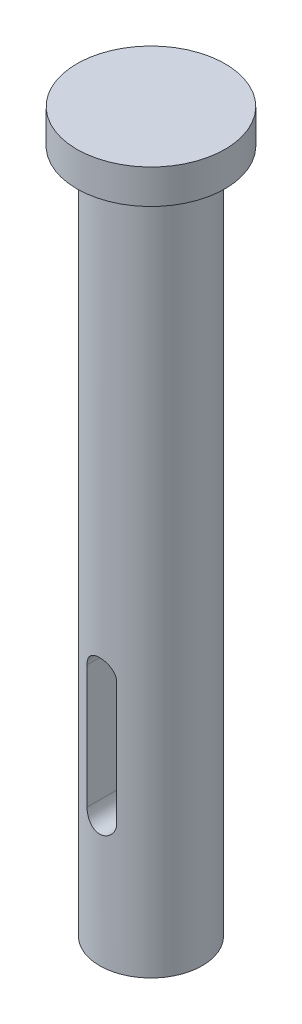
ISO-10303-21;
HEADER;
FILE_DESCRIPTION(('STEP AP214'),'2;1');
FILE_NAME('part.step','',(''),(''),'','','');
FILE_SCHEMA(('AUTOMOTIVE_DESIGN { 1 0 10303 214 1 1 1 1 }'));
ENDSEC;
DATA;
#1=APPLICATION_CONTEXT('core data for automotive mechanical design processes');
#2=APPLICATION_PROTOCOL_DEFINITION('international standard','automotive_design',2000,#1);
#3=PRODUCT_CONTEXT('',#1,'mechanical');
#4=PRODUCT('Part','Part','',(#3));
#5=PRODUCT_RELATED_PRODUCT_CATEGORY('part','',(#4));
#6=PRODUCT_DEFINITION_FORMATION('','',#4);
#7=PRODUCT_DEFINITION_CONTEXT('part definition',#1,'design');
#8=PRODUCT_DEFINITION('design','',#6,#7);
#9=PRODUCT_DEFINITION_SHAPE('','',#8);
#10=(LENGTH_UNIT() NAMED_UNIT(*) SI_UNIT(.MILLI.,.METRE.));
#11=(NAMED_UNIT(*) PLANE_ANGLE_UNIT() SI_UNIT($,.RADIAN.));
#12=(NAMED_UNIT(*) SI_UNIT($,.STERADIAN.) SOLID_ANGLE_UNIT());
#13=UNCERTAINTY_MEASURE_WITH_UNIT(LENGTH_MEASURE(1.E-05),#10,'distance_accuracy_value','');
#14=(GEOMETRIC_REPRESENTATION_CONTEXT(3) GLOBAL_UNCERTAINTY_ASSIGNED_CONTEXT((#13)) GLOBAL_UNIT_ASSIGNED_CONTEXT((#10,
#11,#12)) REPRESENTATION_CONTEXT('',''));
#15=CARTESIAN_POINT('',(0.,0.,0.));
#16=DIRECTION('',(0.,0.,1.));
#17=DIRECTION('',(1.,0.,0.));
#18=AXIS2_PLACEMENT_3D('',#15,#16,#17);
#19=CARTESIAN_POINT('',(0.,160.02,0.));
#20=DIRECTION('',(0.,-1.,0.));
#21=DIRECTION('',(0.,0.,-1.));
#22=AXIS2_PLACEMENT_3D('',#19,#20,#21);
#23=CYLINDRICAL_SURFACE('',#22,11.43);
#24=CARTESIAN_POINT('',(0.,0.,0.));
#25=DIRECTION('',(0.,1.,0.));
#26=DIRECTION('',(0.,0.,1.));
#27=AXIS2_PLACEMENT_3D('',#24,#25,#26);
#28=CIRCLE('',#27,11.43);
#29=CARTESIAN_POINT('',(0.,0.,11.43));
#30=VERTEX_POINT('',#29);
#31=EDGE_CURVE('E153',#30,#30,#28,.T.);
#32=ORIENTED_EDGE('',*,*,#31,.T.);
#33=EDGE_LOOP('',(#32));
#34=FACE_BOUND('',#33,.T.);
#35=DIRECTION('',(0.,-1.,0.));
#36=VECTOR('',#35,1.);
#37=CARTESIAN_POINT('',(3.30199968300475,160.02,10.9426549837522));
#38=LINE('',#37,#36);
#39=CARTESIAN_POINT('',(3.30199968300475,56.1339996695718,10.9426549837522));
#40=VERTEX_POINT('',#39);
#41=CARTESIAN_POINT('',(3.30199968300478,28.702000652588,10.9426549837522));
#42=VERTEX_POINT('',#41);
#43=EDGE_CURVE('E82',#40,#42,#38,.T.);
#44=ORIENTED_EDGE('',*,*,#43,.T.);
#45=CARTESIAN_POINT('',(3.30199968300478,28.702000652588,10.9426549837522));
#46=CARTESIAN_POINT('',(3.30201083959326,28.6112112309869,10.9426429087671));
#47=CARTESIAN_POINT('',(3.2982555000493,28.5204288218974,10.9437845945731));
#48=CARTESIAN_POINT('',(3.28329845120707,28.3395534855812,10.9482858329146));
#49=CARTESIAN_POINT('',(3.27209831420528,28.2494604168329,10.9516449171478));
#50=CARTESIAN_POINT('',(3.24237390580761,28.0708147684955,10.9604807615123));
#51=CARTESIAN_POINT('',(3.22386726106636,27.9822590130391,10.9659524244373));
#52=CARTESIAN_POINT('',(3.17970921283354,27.8071152644384,10.978837580216));
#53=CARTESIAN_POINT('',(3.15405764400974,27.7205273168791,10.9862511180043));
#54=CARTESIAN_POINT('',(3.06669238552717,27.4646642030274,11.0110858179221));
#55=CARTESIAN_POINT('',(2.99453188264708,27.2990741012283,11.0311125369567));
#56=CARTESIAN_POINT('',(2.82460736121545,26.9823585032287,11.0758370133616));
#57=CARTESIAN_POINT('',(2.72683262011485,26.8312391009682,11.1005367257192));
#58=CARTESIAN_POINT('',(2.5053851800656,26.5432786270554,11.1526316818163));
#59=CARTESIAN_POINT('',(2.38109716111845,26.4069195688495,11.1800808566986));
#60=CARTESIAN_POINT('',(2.11147003232109,26.1566620276346,11.2341208915755));
#61=CARTESIAN_POINT('',(1.96612742462546,26.0427672841112,11.2607116080533));
#62=CARTESIAN_POINT('',(1.65509365009165,25.8385901350348,11.3106500088386));
#63=CARTESIAN_POINT('',(1.48906766416633,25.7487987342244,11.333926285317));
#64=CARTESIAN_POINT('',(1.14349509824243,25.5985994154898,11.3739845243319));
#65=CARTESIAN_POINT('',(0.963951818965169,25.5381843510042,11.3907680661922));
#66=CARTESIAN_POINT('',(0.601510727887433,25.4500408390082,11.4155677099243));
#67=CARTESIAN_POINT('',(0.418829686833354,25.4214845278902,11.4238054567622));
#68=CARTESIAN_POINT('',(0.0510924066887405,25.3952559026843,11.4313640511465));
#69=CARTESIAN_POINT('',(-0.133963413049841,25.3975782088518,11.4306864519455));
#70=CARTESIAN_POINT('',(-0.495397591399471,25.4324769811574,11.4206490058453));
#71=CARTESIAN_POINT('',(-0.671870754801768,25.4641571001583,11.4115463996912));
#72=CARTESIAN_POINT('',(-1.01687808512803,25.5554129724509,11.3859913480712));
#73=CARTESIAN_POINT('',(-1.18541184716721,25.6149901467144,11.3695385282148));
#74=CARTESIAN_POINT('',(-1.51194497621491,25.7609845032003,11.3307669774951));
#75=CARTESIAN_POINT('',(-1.66980652361981,25.8476924884333,11.3083851148713));
#76=CARTESIAN_POINT('',(-1.9690292557211,26.0452554529799,11.2601432863006));
#77=CARTESIAN_POINT('',(-2.1103870044902,26.1561154467827,11.2342825985002));
#78=CARTESIAN_POINT('',(-2.37793178215076,26.4035212222926,11.1807708066999));
#79=CARTESIAN_POINT('',(-2.50339565956968,26.540843679194,11.1530887472081));
#80=CARTESIAN_POINT('',(-2.72972929794975,26.8348532248857,11.0998661849813));
#81=CARTESIAN_POINT('',(-2.83059204499695,26.9915458170633,11.0743262943487));
#82=CARTESIAN_POINT('',(-3.00558608673521,27.3218475127088,11.0281311836041));
#83=CARTESIAN_POINT('',(-3.07947321999842,27.4955939001078,11.0075211348333));
#84=CARTESIAN_POINT('',(-3.16735344932953,27.7639319406655,10.9824254132337));
#85=CARTESIAN_POINT('',(-3.19281956446441,27.8546493909043,10.9750307749866));
#86=CARTESIAN_POINT('',(-3.23593023283908,28.0380597002293,10.9623978810592));
#87=CARTESIAN_POINT('',(-3.25357840619661,28.1307516241467,10.9571586274028));
#88=CARTESIAN_POINT('',(-3.27880211126455,28.3031792093433,10.9496350189902));
#89=CARTESIAN_POINT('',(-3.28750207364252,28.3827389975838,10.947022239621));
#90=CARTESIAN_POINT('',(-3.29909958616893,28.542196377068,10.943530029869));
#91=CARTESIAN_POINT('',(-3.30200592117769,28.6220932725115,10.9426479752252));
#92=CARTESIAN_POINT('',(-3.30200031699521,28.7020000185976,10.9426547924424));
#93=B_SPLINE_CURVE_WITH_KNOTS('',3,(#45,#46,#47,#48,#49,#50,#51,#52,#53,#54,#55,#56,#57,#58,#59,
#60,#61,#62,#63,#64,#65,#66,#67,#68,#69,#70,#71,#72,#73,#74,#75,#76,#77,#78,#79,#80,#81,#82,#83,
#84,#85,#86,#87,#88,#89,#90,#91,#92),.UNSPECIFIED.,.F.,.F.,(4,2,2,2,2,2,2,2,2,2,2,2,2,2,2,2,2,2,
2,2,2,2,2,4),(0.,0.27227147527736,0.544485466717382,0.81604672682224,1.08761427132711,
1.63010064254451,2.17281447153649,2.72984963807595,3.28697745245675,3.85471570174013,
4.42231576467131,4.9747955768686,5.52717913600924,6.06323414713446,6.59931646587124,
7.14135390825003,7.68350399698142,8.24503882955919,8.80673357207435,9.37339317231377,
9.65663330028747,9.93974213575611,10.1797502575283,10.4193941780254),.UNSPECIFIED.);
#94=CARTESIAN_POINT('',(-3.30200031699524,28.7020000185976,10.9426547924424));
#95=VERTEX_POINT('',#94);
#96=EDGE_CURVE('E113',#42,#95,#93,.T.);
#97=ORIENTED_EDGE('',*,*,#96,.T.);
#98=DIRECTION('',(0.,-1.,0.));
#99=VECTOR('',#98,1.);
#100=CARTESIAN_POINT('',(-3.30200031699527,160.02,10.9426547924424));
#101=LINE('',#100,#99);
#102=CARTESIAN_POINT('',(-3.30200031699527,56.1340003035623,10.9426547924424));
#103=VERTEX_POINT('',#102);
#104=EDGE_CURVE('E112',#95,#103,#101,.F.);
#105=ORIENTED_EDGE('',*,*,#104,.T.);
#106=CARTESIAN_POINT('',(-3.30200031699525,56.1340003035623,10.9426547924424));
#107=CARTESIAN_POINT('',(-3.30201144729442,56.224789726793,10.9426427253901));
#108=CARTESIAN_POINT('',(-3.29825608132859,56.3155721363102,10.9437844194061));
#109=CARTESIAN_POINT('',(-3.28329897963043,56.4964474710653,10.9482856744644));
#110=CARTESIAN_POINT('',(-3.2720988161964,56.5865405378255,10.9516447672037));
#111=CARTESIAN_POINT('',(-3.24237435523471,56.7651861797615,10.9604806285998));
#112=CARTESIAN_POINT('',(-3.22386768436513,56.8537419308112,10.9659523000488));
#113=CARTESIAN_POINT('',(-3.17970958434121,57.0288856683113,10.9788374726768));
#114=CARTESIAN_POINT('',(-3.15405798985411,57.1154736091767,10.9862510187902));
#115=CARTESIAN_POINT('',(-3.06669265546892,57.3713366994661,11.0110857430294));
#116=CARTESIAN_POINT('',(-2.9945321033401,57.5369267811046,11.0311124774379));
#117=CARTESIAN_POINT('',(-2.82460748731822,57.8536423311356,11.0758369815945));
#118=CARTESIAN_POINT('',(-2.72683270086808,58.0047617055793,11.1005367063304));
#119=CARTESIAN_POINT('',(-2.5053851717744,58.2927221187623,11.152631684168));
#120=CARTESIAN_POINT('',(-2.38109710884742,58.4290811435535,11.1800808683481));
#121=CARTESIAN_POINT('',(-2.11146989717645,58.6793386107683,11.2341209174904));
#122=CARTESIAN_POINT('',(-1.96612725059404,58.7932333137115,11.2607116389351));
#123=CARTESIAN_POINT('',(-1.65509340784502,58.9974103715154,11.3106500447416));
#124=CARTESIAN_POINT('',(-1.48906739317617,59.0872017221889,11.3339263212909));
#125=CARTESIAN_POINT('',(-1.14349477827938,59.237400936101,11.3739845568681));
#126=CARTESIAN_POINT('',(-0.963951478772977,59.2978159459069,11.3907680952222));
#127=CARTESIAN_POINT('',(-0.601510362396344,59.3859593456628,11.4155677293346));
#128=CARTESIAN_POINT('',(-0.41882931624041,59.414515600151,11.4238054703489));
#129=CARTESIAN_POINT('',(-0.0510920356885373,59.4407441126334,11.4313640528076));
#130=CARTESIAN_POINT('',(0.133963779357455,59.4384217503681,11.4306864475035));
#131=CARTESIAN_POINT('',(0.495397941649429,59.4035228696293,11.4206489905516));
#132=CARTESIAN_POINT('',(0.671871093918139,59.371842697826,11.411546379498));
#133=CARTESIAN_POINT('',(1.01687839375541,59.2805867228353,11.3859913202822));
#134=CARTESIAN_POINT('',(1.18541213643744,59.2210094986717,11.3695384977286));
#135=CARTESIAN_POINT('',(1.511945223487,59.0750150439461,11.3307669442273));
#136=CARTESIAN_POINT('',(1.66980674784278,58.9883070097286,11.3083850814044));
#137=CARTESIAN_POINT('',(1.96902942636009,58.7907439509166,11.2601432561019));
#138=CARTESIAN_POINT('',(2.11038714459439,58.679883911836,11.2342825717698));
#139=CARTESIAN_POINT('',(2.37793185216547,58.4324780496227,11.1807707913564));
#140=CARTESIAN_POINT('',(2.50339568990815,58.2951555516051,11.1530887399377));
#141=CARTESIAN_POINT('',(2.72972924226733,58.0011459300188,11.0998661982118));
#142=CARTESIAN_POINT('',(2.83059194296475,57.8444533030621,11.0743263200085));
#143=CARTESIAN_POINT('',(3.00558588236283,57.5141515513603,11.0281312388506));
#144=CARTESIAN_POINT('',(3.07947296057822,57.3404051433141,11.0075212070864));
#145=CARTESIAN_POINT('',(3.16735310544411,57.0720670796585,10.9824255123268));
#146=CARTESIAN_POINT('',(3.1928191921037,56.9813496230956,10.9750308832496));
#147=CARTESIAN_POINT('',(3.23592980314594,56.7979393038028,10.9623980078375));
#148=CARTESIAN_POINT('',(3.25357794765006,56.7052473762414,10.9571587635257));
#149=CARTESIAN_POINT('',(3.27880158270072,56.5328199005894,10.9496351772149));
#150=CARTESIAN_POINT('',(3.28750151217978,56.4532602264254,10.9470224082113));
#151=CARTESIAN_POINT('',(3.29909897575358,56.2938030776155,10.9435302138826));
#152=CARTESIAN_POINT('',(3.30200529468888,56.2139062987662,10.942648164303));
#153=CARTESIAN_POINT('',(3.30199968300475,56.1339996695718,10.9426549837522));
#154=B_SPLINE_CURVE_WITH_KNOTS('',3,(#106,#107,#108,#109,#110,#111,#112,#113,#114,#115,#116,
#117,#118,#119,#120,#121,#122,#123,#124,#125,#126,#127,#128,#129,#130,#131,#132,#133,#134,#135,
#136,#137,#138,#139,#140,#141,#142,#143,#144,#145,#146,#147,#148,#149,#150,#151,#152,#153),
.UNSPECIFIED.,.F.,.F.,(4,2,2,2,2,2,2,2,2,2,2,2,2,2,2,2,2,2,2,2,2,2,2,4),(0.,0.272271480130543,
0.544485476356451,0.816046741088104,1.08761429023994,1.63010067014953,2.17281450804257,
2.72984969314374,3.2869775259252,3.85471577933668,4.42231584629948,4.9747956467213,
5.52717919415642,6.06323420127886,6.59931651610072,7.1413539685628,7.6835040673262,
8.24503890682228,8.80673365633093,9.37339324345031,9.65663336449064,9.93974219290006,
10.1797499639468,10.4193935340125),.UNSPECIFIED.);
#155=EDGE_CURVE('E56',#103,#40,#154,.T.);
#156=ORIENTED_EDGE('',*,*,#155,.T.);
#157=EDGE_LOOP('',(#44,#97,#105,#156));
#158=FACE_BOUND('',#157,.T.);
#159=DIRECTION('',(0.,-1.,0.));
#160=VECTOR('',#159,1.);
#161=CARTESIAN_POINT('',(3.30199968300475,160.02,-10.9426549837522));
#162=LINE('',#161,#160);
#163=CARTESIAN_POINT('',(3.30199968300478,28.702000652588,-10.9426549837522));
#164=VERTEX_POINT('',#163);
#165=CARTESIAN_POINT('',(3.30199968300475,56.1339996695718,-10.9426549837522));
#166=VERTEX_POINT('',#165);
#167=EDGE_CURVE('E90',#164,#166,#162,.F.);
#168=ORIENTED_EDGE('',*,*,#167,.T.);
#169=CARTESIAN_POINT('',(3.30199968300475,56.1339996695718,-10.9426549837522));
#170=CARTESIAN_POINT('',(3.30201083073519,56.2247890920399,-10.9426429114403));
#171=CARTESIAN_POINT('',(3.29825548226283,56.3155715015917,-10.9437845999403));
#172=CARTESIAN_POINT('',(3.28329841550615,56.4964468380206,-10.9482858436276));
#173=CARTESIAN_POINT('',(3.27209826951882,56.5865399064195,-10.9516449305123));
#174=CARTESIAN_POINT('',(3.24237384319298,56.765185553258,-10.9604807800484));
#175=CARTESIAN_POINT('',(3.22386718950899,56.853741307567,-10.9659524454935));
#176=CARTESIAN_POINT('',(3.17970912348641,57.0288850530991,-10.9788376061123));
#177=CARTESIAN_POINT('',(3.15405754581543,57.1154729987373,-10.9862511462204));
#178=CARTESIAN_POINT('',(3.06669226105566,57.3713361056571,-11.0110858526867));
#179=CARTESIAN_POINT('',(2.99453174097963,57.5369262013258,-11.0311125755484));
#180=CARTESIAN_POINT('',(2.82460718619827,57.8536417843825,-11.0758370581298));
#181=CARTESIAN_POINT('',(2.72683242894259,58.0047611778285,-11.1005367728366));
#182=CARTESIAN_POINT('',(2.50538495720313,58.2927216317658,-11.1526317320478));
#183=CARTESIAN_POINT('',(2.38109692269272,58.4290806786952,-11.1800809076552));
#184=CARTESIAN_POINT('',(2.11146976440191,58.6793381947776,-11.2341209421076));
#185=CARTESIAN_POINT('',(1.96612714277885,58.793232924447,-11.2607116574356));
#186=CARTESIAN_POINT('',(1.65509334438619,58.9974100416659,-11.3106500537196));
#187=CARTESIAN_POINT('',(1.48906734881656,59.0872014247872,-11.3339263268644));
#188=CARTESIAN_POINT('',(1.1434947667223,59.237400706667,-11.3739845577771));
#189=CARTESIAN_POINT('',(0.963951480919159,59.2978157519892,-11.3907680948697));
#190=CARTESIAN_POINT('',(0.601510382337648,59.3859592247986,-11.4155677281703));
#191=CARTESIAN_POINT('',(0.418829340294082,59.4145155162299,-11.423805469452));
#192=CARTESIAN_POINT('',(0.0510920617338848,59.4407441025255,-11.4313640526744));
#193=CARTESIAN_POINT('',(-0.133963755431573,59.4384217771322,-11.4306864478671));
#194=CARTESIAN_POINT('',(-0.495397926945187,59.4035229679554,-11.4206489912522));
#195=CARTESIAN_POINT('',(-0.671871086155528,59.3718428310273,-11.4115463801018));
#196=CARTESIAN_POINT('',(-1.01687840522502,59.2805869240479,-11.3859913194038));
#197=CARTESIAN_POINT('',(-1.18541216019847,59.221009733022,-11.3695384954651));
#198=CARTESIAN_POINT('',(-1.51194527477388,59.0750153433962,-11.330766937573));
#199=CARTESIAN_POINT('',(-1.66980681457529,58.9883073414452,-11.3083850717959));
#200=CARTESIAN_POINT('',(-1.96902952886277,58.7907443446797,-11.2601432384239));
#201=CARTESIAN_POINT('',(-2.11038726742266,58.6798843353786,-11.234282548976));
#202=CARTESIAN_POINT('',(-2.37793202182582,58.4324785298786,-11.1807707555835));
#203=CARTESIAN_POINT('',(-2.50339588611742,58.2951560585477,-11.1530886962099));
#204=CARTESIAN_POINT('',(-2.72972949589953,58.0011464859126,-11.0998661361524));
#205=CARTESIAN_POINT('',(-2.83059222746612,57.8444538812143,-11.0743262475722));
#206=CARTESIAN_POINT('',(-3.00558623457768,57.5141521652654,-11.0281311431614));
#207=CARTESIAN_POINT('',(-3.07947334907538,57.3404057703306,-11.0075210986145));
#208=CARTESIAN_POINT('',(-3.16735354947198,57.0720677211748,-10.9824253843238));
#209=CARTESIAN_POINT('',(-3.19281965482178,56.981350268594,-10.9750307486782));
#210=CARTESIAN_POINT('',(-3.23593030346268,56.7979399554896,-10.9623978601922));
#211=CARTESIAN_POINT('',(-3.25357846687531,56.7052480301355,-10.9571586093745));
#212=CARTESIAN_POINT('',(-3.27880213737385,56.5328205535904,-10.9496350111408));
#213=CARTESIAN_POINT('',(-3.28750208314862,56.4532608765433,-10.9470222367531));
#214=CARTESIAN_POINT('',(-3.29909957871151,56.2938037206394,-10.9435300321205));
#215=CARTESIAN_POINT('',(-3.30200591333904,56.213906937581,-10.9426479776208));
#216=CARTESIAN_POINT('',(-3.30200031699525,56.1340003035623,-10.9426547924424));
#217=B_SPLINE_CURVE_WITH_KNOTS('',3,(#169,#170,#171,#172,#173,#174,#175,#176,#177,#178,#179,
#180,#181,#182,#183,#184,#185,#186,#187,#188,#189,#190,#191,#192,#193,#194,#195,#196,#197,#198,
#199,#200,#201,#202,#203,#204,#205,#206,#207,#208,#209,#210,#211,#212,#213,#214,#215,#216),
.UNSPECIFIED.,.F.,.F.,(4,2,2,2,2,2,2,2,2,2,2,2,2,2,2,2,2,2,2,2,2,2,2,4),(0.,0.272271477867014,
0.544485471878624,0.816046734552167,1.08761428163153,1.63010065783912,2.1728144918596,
2.72984966501832,3.28697748595281,3.85471573416677,4.42231579598988,4.97479560132888,
5.52717915364841,6.06323416272792,6.59931647947069,7.14135392711782,7.68350402106486,
8.24503885884496,8.80673360677575,9.37339320436732,9.65663333058084,9.93974216415527,
10.1797499495887,10.4193935341036),.UNSPECIFIED.);
#218=CARTESIAN_POINT('',(-3.30200031699525,56.1340003035623,-10.9426547924424));
#219=VERTEX_POINT('',#218);
#220=EDGE_CURVE('E41',#166,#219,#217,.T.);
#221=ORIENTED_EDGE('',*,*,#220,.T.);
#222=DIRECTION('',(0.,-1.,0.));
#223=VECTOR('',#222,1.);
#224=CARTESIAN_POINT('',(-3.30200031699527,160.02,-10.9426547924424));
#225=LINE('',#224,#223);
#226=CARTESIAN_POINT('',(-3.30200031699527,28.7020000185976,-10.9426547924424));
#227=VERTEX_POINT('',#226);
#228=EDGE_CURVE('E74',#219,#227,#225,.T.);
#229=ORIENTED_EDGE('',*,*,#228,.T.);
#230=CARTESIAN_POINT('',(-3.30200031699521,28.7020000185976,-10.9426547924424));
#231=CARTESIAN_POINT('',(-3.30201145615243,28.6112105962339,-10.9426427227169));
#232=CARTESIAN_POINT('',(-3.29825609911501,28.5204281871791,-10.9437844140389));
#233=CARTESIAN_POINT('',(-3.2832990153313,28.3395528525366,-10.9482856637514));
#234=CARTESIAN_POINT('',(-3.27209886088282,28.2494597854269,-10.9516447538392));
#235=CARTESIAN_POINT('',(-3.24237441784929,28.0708141419921,-10.9604806100638));
#236=CARTESIAN_POINT('',(-3.22386775592246,27.982258389795,-10.9659522789926));
#237=CARTESIAN_POINT('',(-3.17970967368832,27.8071146492263,-10.9788374467805));
#238=CARTESIAN_POINT('',(-3.15405808804839,27.7205267064398,-10.9862509905741));
#239=CARTESIAN_POINT('',(-3.06669277994041,27.4646636092185,-11.0110857082647));
#240=CARTESIAN_POINT('',(-2.99453224500753,27.2990735214496,-11.0311124388463));
#241=CARTESIAN_POINT('',(-2.82460766233541,26.9823579564758,-11.0758369368263));
#242=CARTESIAN_POINT('',(-2.72683289204035,26.8312385732174,-11.100536659213));
#243=CARTESIAN_POINT('',(-2.5053853946369,26.543278140059,-11.1526316339365));
#244=CARTESIAN_POINT('',(-2.38109734727318,26.4069191039913,-11.1800808173915));
#245=CARTESIAN_POINT('',(-2.11147016509567,26.1566616116439,-11.2341208669583));
#246=CARTESIAN_POINT('',(-1.96612753244068,26.0427668948467,-11.2607115895529));
#247=CARTESIAN_POINT('',(-1.65509371355053,25.8385898051853,-11.3106499998606));
#248=CARTESIAN_POINT('',(-1.48906770852598,25.7487984368227,-11.3339262797434));
#249=CARTESIAN_POINT('',(-1.14349510979955,25.5985991860558,-11.3739845234229));
#250=CARTESIAN_POINT('',(-0.963951816819031,25.5381841570866,-11.3907680665448));
#251=CARTESIAN_POINT('',(-0.601510707946168,25.450040718144,-11.4155677110886));
#252=CARTESIAN_POINT('',(-0.418829662779718,25.421484443969,-11.4238054576591));
#253=CARTESIAN_POINT('',(-0.051092380643419,25.3952558925763,-11.4313640512797));
#254=CARTESIAN_POINT('',(0.133963436975703,25.3975782356159,-11.4306864515819));
#255=CARTESIAN_POINT('',(0.495397606103703,25.4324770794834,-11.4206490051447));
#256=CARTESIAN_POINT('',(0.671870762564372,25.4641572333596,-11.4115463990874));
#257=CARTESIAN_POINT('',(1.01687807365842,25.5554131736634,-11.3859913489496));
#258=CARTESIAN_POINT('',(1.18541182340619,25.6149903810647,-11.3695385304783));
#259=CARTESIAN_POINT('',(1.51194492492804,25.7609848026503,-11.3307669841494));
#260=CARTESIAN_POINT('',(1.66980645688734,25.8476928201498,-11.3083851244798));
#261=CARTESIAN_POINT('',(1.96902915321847,26.0452558467429,-11.2601433039787));
#262=CARTESIAN_POINT('',(2.11038688166198,26.1561158703252,-11.234282621294));
#263=CARTESIAN_POINT('',(2.37793161249047,26.4035217025483,-11.1807708424728));
#264=CARTESIAN_POINT('',(2.50339546336049,26.5408441861365,-11.1530887909358));
#265=CARTESIAN_POINT('',(2.72972904431765,26.8348537807794,-11.0998662470407));
#266=CARTESIAN_POINT('',(2.83059176049569,26.9915463952153,-11.074326366785));
#267=CARTESIAN_POINT('',(3.00558573452049,27.3218481266136,-11.0281312792932));
#268=CARTESIAN_POINT('',(3.0794728315014,27.4955945271241,-11.0075212433051));
#269=CARTESIAN_POINT('',(3.16735300530182,27.7639325821817,-10.9824255412366));
#270=CARTESIAN_POINT('',(3.19281910174649,27.8546500364025,-10.9750309095579));
#271=CARTESIAN_POINT('',(3.2359297325225,28.038060351916,-10.9623980287045));
#272=CARTESIAN_POINT('',(3.25357788697154,28.1307522780406,-10.9571587815539));
#273=CARTESIAN_POINT('',(3.27880155659158,28.3031798623442,-10.9496351850642));
#274=CARTESIAN_POINT('',(3.28750150267382,28.3827396477016,-10.9470224110791));
#275=CARTESIAN_POINT('',(3.29909898321111,28.5421970200917,-10.9435302116311));
#276=CARTESIAN_POINT('',(3.30200530252761,28.6220939113261,-10.9426481619073));
#277=CARTESIAN_POINT('',(3.30199968300478,28.702000652588,-10.9426549837522));
#278=B_SPLINE_CURVE_WITH_KNOTS('',3,(#230,#231,#232,#233,#234,#235,#236,#237,#238,#239,#240,
#241,#242,#243,#244,#245,#246,#247,#248,#249,#250,#251,#252,#253,#254,#255,#256,#257,#258,#259,
#260,#261,#262,#263,#264,#265,#266,#267,#268,#269,#270,#271,#272,#273,#274,#275,#276,#277),
.UNSPECIFIED.,.F.,.F.,(4,2,2,2,2,2,2,2,2,2,2,2,2,2,2,2,2,2,2,2,2,2,2,4),(0.,0.272271477540879,
0.544485471195199,0.816046733358166,1.0876142799355,1.6301006548549,2.17281448771943,
2.72984966620134,3.2869774924291,3.85471574691,4.42231581498088,4.974795622261,5.52717917651723,
6.06323418568537,6.59931650250125,7.14135394969498,7.68350404324273,8.24503887753648,
8.8067336216295,9.37339321139673,9.65663333419726,9.93974216450089,10.1797502718864,
10.4193941779343),.UNSPECIFIED.);
#279=EDGE_CURVE('E81',#227,#164,#278,.T.);
#280=ORIENTED_EDGE('',*,*,#279,.T.);
#281=EDGE_LOOP('',(#168,#221,#229,#280));
#282=FACE_BOUND('',#281,.T.);
#283=CARTESIAN_POINT('',(0.,152.4,0.));
#284=DIRECTION('',(0.,1.,0.));
#285=DIRECTION('',(0.,0.,1.));
#286=AXIS2_PLACEMENT_3D('',#283,#284,#285);
#287=CIRCLE('',#286,11.43);
#288=CARTESIAN_POINT('',(0.,152.4,11.43));
#289=VERTEX_POINT('',#288);
#290=EDGE_CURVE('E11',#289,#289,#287,.T.);
#291=ORIENTED_EDGE('',*,*,#290,.F.);
#292=EDGE_LOOP('',(#291));
#293=FACE_BOUND('',#292,.T.);
#294=ADVANCED_FACE('F33',(#34,#158,#282,#293),#23,.T.);
#295=CARTESIAN_POINT('',(0.,0.,0.));
#296=DIRECTION('',(0.,1.,0.));
#297=DIRECTION('',(0.,0.,1.));
#298=AXIS2_PLACEMENT_3D('',#295,#296,#297);
#299=PLANE('',#298);
#300=ORIENTED_EDGE('',*,*,#31,.F.);
#301=EDGE_LOOP('',(#300));
#302=FACE_BOUND('',#301,.T.);
#303=ADVANCED_FACE('F102',(#302),#299,.F.);
#304=CARTESIAN_POINT('',(-3.1699524535402E-07,56.134,-62.23));
#305=DIRECTION('',(0.,0.,1.));
#306=DIRECTION('',(1.,0.,0.));
#307=AXIS2_PLACEMENT_3D('',#304,#305,#306);
#308=CYLINDRICAL_SURFACE('',#307,3.30200000000002);
#309=DIRECTION('',(0.,0.,1.));
#310=VECTOR('',#309,1.);
#311=CARTESIAN_POINT('',(-3.30200031699525,56.1340003035623,-62.23));
#312=LINE('',#311,#310);
#313=EDGE_CURVE('E76',#219,#103,#312,.T.);
#314=ORIENTED_EDGE('',*,*,#313,.F.);
#315=ORIENTED_EDGE('',*,*,#220,.F.);
#316=DIRECTION('',(0.,0.,1.));
#317=VECTOR('',#316,1.);
#318=CARTESIAN_POINT('',(3.30199968300475,56.1339996695718,-62.23));
#319=LINE('',#318,#317);
#320=EDGE_CURVE('E156',#166,#40,#319,.T.);
#321=ORIENTED_EDGE('',*,*,#320,.T.);
#322=ORIENTED_EDGE('',*,*,#155,.F.);
#323=EDGE_LOOP('',(#314,#315,#321,#322));
#324=FACE_BOUND('',#323,.T.);
#325=ADVANCED_FACE('F84',(#324),#308,.F.);
#326=CARTESIAN_POINT('',(3.30199968300475,28.702000652588,-62.23));
#327=DIRECTION('',(1.,0.,0.));
#328=DIRECTION('',(0.,1.,0.));
#329=AXIS2_PLACEMENT_3D('',#326,#327,#328);
#330=PLANE('',#329);
#331=ORIENTED_EDGE('',*,*,#320,.F.);
#332=ORIENTED_EDGE('',*,*,#167,.F.);
#333=DIRECTION('',(0.,0.,1.));
#334=VECTOR('',#333,1.);
#335=CARTESIAN_POINT('',(3.30199968300478,28.702000652588,-62.23));
#336=LINE('',#335,#334);
#337=EDGE_CURVE('E158',#164,#42,#336,.T.);
#338=ORIENTED_EDGE('',*,*,#337,.T.);
#339=ORIENTED_EDGE('',*,*,#43,.F.);
#340=EDGE_LOOP('',(#331,#332,#338,#339));
#341=FACE_BOUND('',#340,.T.);
#342=ADVANCED_FACE('F101',(#341),#330,.F.);
#343=CARTESIAN_POINT('',(-3.16995181815868E-07,28.702,-62.23));
#344=DIRECTION('',(0.,0.,1.));
#345=DIRECTION('',(1.,0.,0.));
#346=AXIS2_PLACEMENT_3D('',#343,#344,#345);
#347=CYLINDRICAL_SURFACE('',#346,3.30200000000003);
#348=ORIENTED_EDGE('',*,*,#337,.F.);
#349=ORIENTED_EDGE('',*,*,#279,.F.);
#350=DIRECTION('',(0.,0.,1.));
#351=VECTOR('',#350,1.);
#352=CARTESIAN_POINT('',(-3.30200031699524,28.7020000185976,-62.23));
#353=LINE('',#352,#351);
#354=EDGE_CURVE('E48',#227,#95,#353,.T.);
#355=ORIENTED_EDGE('',*,*,#354,.T.);
#356=ORIENTED_EDGE('',*,*,#96,.F.);
#357=EDGE_LOOP('',(#348,#349,#355,#356));
#358=FACE_BOUND('',#357,.T.);
#359=ADVANCED_FACE('F123',(#358),#347,.F.);
#360=CARTESIAN_POINT('',(-3.30200031699524,28.7020000185976,-62.23));
#361=DIRECTION('',(-1.,0.,0.));
#362=DIRECTION('',(0.,-1.,0.));
#363=AXIS2_PLACEMENT_3D('',#360,#361,#362);
#364=PLANE('',#363);
#365=ORIENTED_EDGE('',*,*,#313,.T.);
#366=ORIENTED_EDGE('',*,*,#104,.F.);
#367=ORIENTED_EDGE('',*,*,#354,.F.);
#368=ORIENTED_EDGE('',*,*,#228,.F.);
#369=EDGE_LOOP('',(#365,#366,#367,#368));
#370=FACE_BOUND('',#369,.T.);
#371=ADVANCED_FACE('F75',(#370),#364,.F.);
#372=CARTESIAN_POINT('',(0.,152.4,0.));
#373=DIRECTION('',(0.,1.,0.));
#374=DIRECTION('',(0.,0.,1.));
#375=AXIS2_PLACEMENT_3D('',#372,#373,#374);
#376=CYLINDRICAL_SURFACE('',#375,16.51);
#377=CARTESIAN_POINT('',(0.,152.4,0.));
#378=DIRECTION('',(0.,1.,0.));
#379=DIRECTION('',(0.,0.,1.));
#380=AXIS2_PLACEMENT_3D('',#377,#378,#379);
#381=CIRCLE('',#380,16.51);
#382=CARTESIAN_POINT('',(0.,152.4,16.51));
#383=VERTEX_POINT('',#382);
#384=EDGE_CURVE('E86',#383,#383,#381,.T.);
#385=CARTESIAN_POINT('',(0.,160.02,0.));
#386=DIRECTION('',(0.,1.,0.));
#387=DIRECTION('',(0.,0.,1.));
#388=AXIS2_PLACEMENT_3D('',#385,#386,#387);
#389=CIRCLE('',#388,16.51);
#390=CARTESIAN_POINT('',(0.,160.02,16.51));
#391=VERTEX_POINT('',#390);
#392=EDGE_CURVE('E162',#391,#391,#389,.T.);
#393=CARTESIAN_POINT('',(0.,152.4,16.51));
#394=CARTESIAN_POINT('',(0.,152.479375,16.51));
#395=CARTESIAN_POINT('',(0.,152.55875,16.51));
#396=CARTESIAN_POINT('',(0.,152.7175,16.51));
#397=CARTESIAN_POINT('',(0.,152.796875,16.51));
#398=CARTESIAN_POINT('',(0.,152.955625,16.51));
#399=CARTESIAN_POINT('',(0.,153.035,16.51));
#400=CARTESIAN_POINT('',(0.,153.19375,16.51));
#401=CARTESIAN_POINT('',(0.,153.273125,16.51));
#402=CARTESIAN_POINT('',(0.,153.431875,16.51));
#403=CARTESIAN_POINT('',(0.,153.51125,16.51));
#404=CARTESIAN_POINT('',(0.,153.67,16.51));
#405=CARTESIAN_POINT('',(0.,153.749375,16.51));
#406=CARTESIAN_POINT('',(0.,153.908125,16.51));
#407=CARTESIAN_POINT('',(0.,153.9875,16.51));
#408=CARTESIAN_POINT('',(0.,154.14625,16.51));
#409=CARTESIAN_POINT('',(0.,154.225625,16.51));
#410=CARTESIAN_POINT('',(0.,154.384375,16.51));
#411=CARTESIAN_POINT('',(0.,154.46375,16.51));
#412=CARTESIAN_POINT('',(0.,154.6225,16.51));
#413=CARTESIAN_POINT('',(0.,154.701875,16.51));
#414=CARTESIAN_POINT('',(0.,154.860625,16.51));
#415=CARTESIAN_POINT('',(0.,154.94,16.51));
#416=CARTESIAN_POINT('',(0.,155.09875,16.51));
#417=CARTESIAN_POINT('',(0.,155.178125,16.51));
#418=CARTESIAN_POINT('',(0.,155.336875,16.51));
#419=CARTESIAN_POINT('',(0.,155.41625,16.51));
#420=CARTESIAN_POINT('',(0.,155.575,16.51));
#421=CARTESIAN_POINT('',(0.,155.654375,16.51));
#422=CARTESIAN_POINT('',(0.,155.813125,16.51));
#423=CARTESIAN_POINT('',(0.,155.8925,16.51));
#424=CARTESIAN_POINT('',(0.,156.05125,16.51));
#425=CARTESIAN_POINT('',(0.,156.130625,16.51));
#426=CARTESIAN_POINT('',(0.,156.289375,16.51));
#427=CARTESIAN_POINT('',(0.,156.36875,16.51));
#428=CARTESIAN_POINT('',(0.,156.5275,16.51));
#429=CARTESIAN_POINT('',(0.,156.606875,16.51));
#430=CARTESIAN_POINT('',(0.,156.765625,16.51));
#431=CARTESIAN_POINT('',(0.,156.845,16.51));
#432=CARTESIAN_POINT('',(0.,157.00375,16.51));
#433=CARTESIAN_POINT('',(0.,157.083125,16.51));
#434=CARTESIAN_POINT('',(0.,157.241875,16.51));
#435=CARTESIAN_POINT('',(0.,157.32125,16.51));
#436=CARTESIAN_POINT('',(0.,157.48,16.51));
#437=CARTESIAN_POINT('',(0.,157.559375,16.51));
#438=CARTESIAN_POINT('',(0.,157.718125,16.51));
#439=CARTESIAN_POINT('',(0.,157.7975,16.51));
#440=CARTESIAN_POINT('',(0.,157.95625,16.51));
#441=CARTESIAN_POINT('',(0.,158.035625,16.51));
#442=CARTESIAN_POINT('',(0.,158.194375,16.51));
#443=CARTESIAN_POINT('',(0.,158.27375,16.51));
#444=CARTESIAN_POINT('',(0.,158.4325,16.51));
#445=CARTESIAN_POINT('',(0.,158.511875,16.51));
#446=CARTESIAN_POINT('',(0.,158.670625,16.51));
#447=CARTESIAN_POINT('',(0.,158.75,16.51));
#448=CARTESIAN_POINT('',(0.,158.90875,16.51));
#449=CARTESIAN_POINT('',(0.,158.988125,16.51));
#450=CARTESIAN_POINT('',(0.,159.146875,16.51));
#451=CARTESIAN_POINT('',(0.,159.22625,16.51));
#452=CARTESIAN_POINT('',(0.,159.385,16.51));
#453=CARTESIAN_POINT('',(0.,159.464375,16.51));
#454=CARTESIAN_POINT('',(0.,159.623125,16.51));
#455=CARTESIAN_POINT('',(0.,159.7025,16.51));
#456=CARTESIAN_POINT('',(0.,159.86125,16.51));
#457=CARTESIAN_POINT('',(0.,159.940625,16.51));
#458=CARTESIAN_POINT('',(0.,160.02,16.51));
#459=B_SPLINE_CURVE_WITH_KNOTS('',3,(#393,#394,#395,#396,#397,#398,#399,#400,#401,#402,#403,
#404,#405,#406,#407,#408,#409,#410,#411,#412,#413,#414,#415,#416,#417,#418,#419,#420,#421,#422,
#423,#424,#425,#426,#427,#428,#429,#430,#431,#432,#433,#434,#435,#436,#437,#438,#439,#440,#441,
#442,#443,#444,#445,#446,#447,#448,#449,#450,#451,#452,#453,#454,#455,#456,#457,#458),
.UNSPECIFIED.,.F.,.F.,(4,2,2,2,2,2,2,2,2,2,2,2,2,2,2,2,2,2,2,2,2,2,2,2,2,2,2,2,2,2,2,2,4),(0.,
0.238125000000006,0.476250000000011,0.714375000000017,0.952500000000023,1.190625,
1.42875000000001,1.66687500000001,1.90500000000002,2.14312500000002,2.38125,2.61937500000001,
2.85750000000001,3.09562500000002,3.33375,3.571875,3.81000000000001,4.04812500000001,
4.28625000000002,4.524375,4.7625,5.00062500000001,5.23875000000001,5.47687499999999,5.715,
5.953125,6.19125000000001,6.42937500000001,6.66749999999999,6.905625,7.14375,7.38187500000001,
7.61999999999999),.UNSPECIFIED.);
#460=EDGE_CURVE('BSEAM132',#383,#391,#459,.T.);
#461=ORIENTED_EDGE('',*,*,#384,.T.);
#462=ORIENTED_EDGE('',*,*,#392,.F.);
#463=ORIENTED_EDGE('',*,*,#460,.T.);
#464=ORIENTED_EDGE('',*,*,#460,.F.);
#465=EDGE_LOOP('',(#461,#463,#462,#464));
#466=FACE_BOUND('',#465,.T.);
#467=ADVANCED_FACE('F132',(#466),#376,.T.);
#468=CARTESIAN_POINT('',(0.,152.4,0.));
#469=DIRECTION('',(0.,1.,0.));
#470=DIRECTION('',(0.,0.,1.));
#471=AXIS2_PLACEMENT_3D('',#468,#469,#470);
#472=PLANE('',#471);
#473=ORIENTED_EDGE('',*,*,#290,.T.);
#474=EDGE_LOOP('',(#473));
#475=FACE_BOUND('',#474,.T.);
#476=ORIENTED_EDGE('',*,*,#384,.F.);
#477=EDGE_LOOP('',(#476));
#478=FACE_BOUND('',#477,.T.);
#479=ADVANCED_FACE('F135',(#475,#478),#472,.F.);
#480=CARTESIAN_POINT('',(0.,160.02,0.));
#481=DIRECTION('',(0.,1.,0.));
#482=DIRECTION('',(0.,0.,1.));
#483=AXIS2_PLACEMENT_3D('',#480,#481,#482);
#484=PLANE('',#483);
#485=ORIENTED_EDGE('',*,*,#392,.T.);
#486=EDGE_LOOP('',(#485));
#487=FACE_BOUND('',#486,.T.);
#488=ADVANCED_FACE('F104',(#487),#484,.T.);
#489=CLOSED_SHELL('',(#294,#303,#325,#342,#359,#371,#467,#479,#488));
#490=MANIFOLD_SOLID_BREP('B2',#489);
#491=ADVANCED_BREP_SHAPE_REPRESENTATION('',(#18,#490),#14);
#492=SHAPE_DEFINITION_REPRESENTATION(#9,#491);
ENDSEC;
END-ISO-10303-21;
